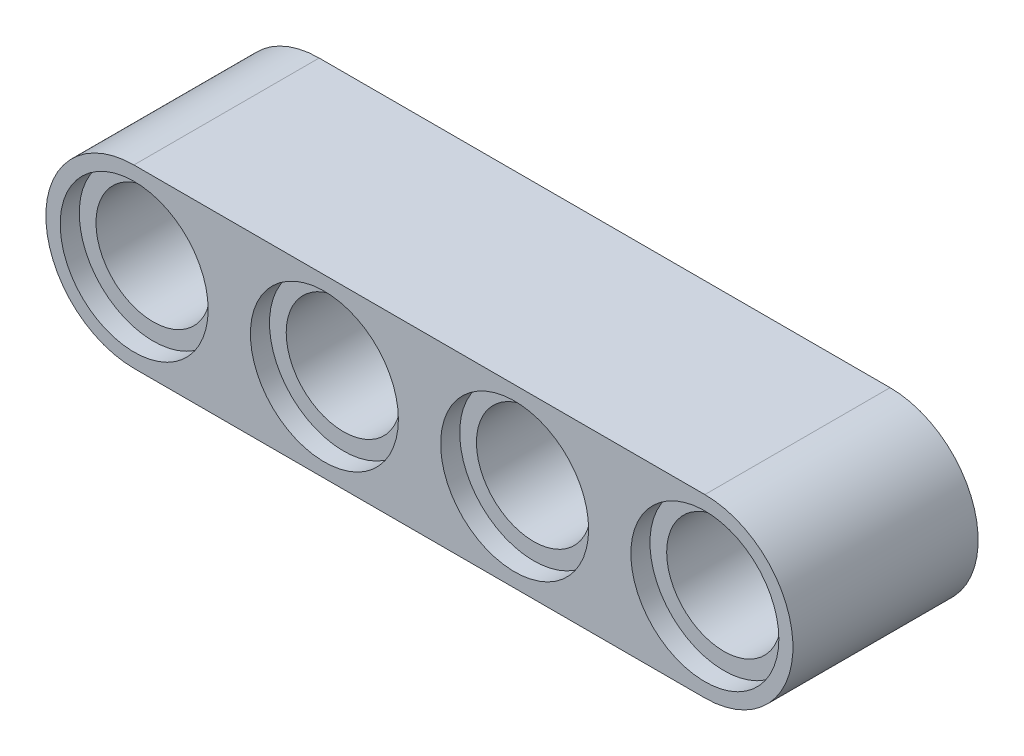
ISO-10303-21;
HEADER;
FILE_DESCRIPTION(('STEP AP214'),'2;1');
FILE_NAME('part.step','',(''),(''),'','','');
FILE_SCHEMA(('AUTOMOTIVE_DESIGN { 1 0 10303 214 1 1 1 1 }'));
ENDSEC;
DATA;
#1=APPLICATION_CONTEXT('core data for automotive mechanical design processes');
#2=APPLICATION_PROTOCOL_DEFINITION('international standard','automotive_design',2000,#1);
#3=PRODUCT_CONTEXT('',#1,'mechanical');
#4=PRODUCT('Part','Part','',(#3));
#5=PRODUCT_RELATED_PRODUCT_CATEGORY('part','',(#4));
#6=PRODUCT_DEFINITION_FORMATION('','',#4);
#7=PRODUCT_DEFINITION_CONTEXT('part definition',#1,'design');
#8=PRODUCT_DEFINITION('design','',#6,#7);
#9=PRODUCT_DEFINITION_SHAPE('','',#8);
#10=(LENGTH_UNIT() NAMED_UNIT(*) SI_UNIT(.MILLI.,.METRE.));
#11=(NAMED_UNIT(*) PLANE_ANGLE_UNIT() SI_UNIT($,.RADIAN.));
#12=(NAMED_UNIT(*) SI_UNIT($,.STERADIAN.) SOLID_ANGLE_UNIT());
#13=UNCERTAINTY_MEASURE_WITH_UNIT(LENGTH_MEASURE(1.E-05),#10,'distance_accuracy_value','');
#14=(GEOMETRIC_REPRESENTATION_CONTEXT(3) GLOBAL_UNCERTAINTY_ASSIGNED_CONTEXT((#13)) GLOBAL_UNIT_ASSIGNED_CONTEXT((#10,
#11,#12)) REPRESENTATION_CONTEXT('',''));
#15=CARTESIAN_POINT('',(0.,0.,0.));
#16=DIRECTION('',(0.,0.,1.));
#17=DIRECTION('',(1.,0.,0.));
#18=AXIS2_PLACEMENT_3D('',#15,#16,#17);
#19=CARTESIAN_POINT('',(-88.6761952861953,0.,7.76));
#20=DIRECTION('',(0.,0.,-1.));
#21=DIRECTION('',(-1.,0.,0.));
#22=AXIS2_PLACEMENT_3D('',#19,#20,#21);
#23=CYLINDRICAL_SURFACE('',#22,2.4);
#24=CARTESIAN_POINT('',(-88.6761952861953,0.,0.8));
#25=DIRECTION('',(0.,0.,-1.));
#26=DIRECTION('',(-1.,0.,0.));
#27=AXIS2_PLACEMENT_3D('',#24,#25,#26);
#28=CIRCLE('',#27,2.4);
#29=CARTESIAN_POINT('',(-91.0761952861953,0.,0.8));
#30=VERTEX_POINT('',#29);
#31=EDGE_CURVE('E120',#30,#30,#28,.T.);
#32=ORIENTED_EDGE('',*,*,#31,.T.);
#33=EDGE_LOOP('',(#32));
#34=FACE_BOUND('',#33,.T.);
#35=CARTESIAN_POINT('',(-88.6761952861953,0.,6.96));
#36=DIRECTION('',(0.,0.,1.));
#37=DIRECTION('',(1.,0.,0.));
#38=AXIS2_PLACEMENT_3D('',#35,#36,#37);
#39=CIRCLE('',#38,2.4);
#40=CARTESIAN_POINT('',(-86.2761952861953,0.,6.96));
#41=VERTEX_POINT('',#40);
#42=EDGE_CURVE('E37',#41,#41,#39,.F.);
#43=ORIENTED_EDGE('',*,*,#42,.F.);
#44=EDGE_LOOP('',(#43));
#45=FACE_BOUND('',#44,.T.);
#46=ADVANCED_FACE('F33',(#34,#45),#23,.F.);
#47=CARTESIAN_POINT('',(-80.7061952861953,0.,7.76));
#48=DIRECTION('',(0.,0.,-1.));
#49=DIRECTION('',(-1.,0.,0.));
#50=AXIS2_PLACEMENT_3D('',#47,#48,#49);
#51=CYLINDRICAL_SURFACE('',#50,2.4);
#52=CARTESIAN_POINT('',(-80.7061952861953,0.,0.8));
#53=DIRECTION('',(0.,0.,-1.));
#54=DIRECTION('',(-1.,0.,0.));
#55=AXIS2_PLACEMENT_3D('',#52,#53,#54);
#56=CIRCLE('',#55,2.4);
#57=CARTESIAN_POINT('',(-83.1061952861953,0.,0.8));
#58=VERTEX_POINT('',#57);
#59=EDGE_CURVE('E124',#58,#58,#56,.T.);
#60=ORIENTED_EDGE('',*,*,#59,.T.);
#61=EDGE_LOOP('',(#60));
#62=FACE_BOUND('',#61,.T.);
#63=CARTESIAN_POINT('',(-80.7061952861953,0.,6.96));
#64=DIRECTION('',(0.,0.,1.));
#65=DIRECTION('',(1.,0.,0.));
#66=AXIS2_PLACEMENT_3D('',#63,#64,#65);
#67=CIRCLE('',#66,2.4);
#68=CARTESIAN_POINT('',(-78.3061952861953,0.,6.96));
#69=VERTEX_POINT('',#68);
#70=EDGE_CURVE('E115',#69,#69,#67,.F.);
#71=ORIENTED_EDGE('',*,*,#70,.F.);
#72=EDGE_LOOP('',(#71));
#73=FACE_BOUND('',#72,.T.);
#74=ADVANCED_FACE('F226',(#62,#73),#51,.F.);
#75=CARTESIAN_POINT('',(-72.7361952861953,0.,7.76));
#76=DIRECTION('',(0.,0.,-1.));
#77=DIRECTION('',(-1.,0.,0.));
#78=AXIS2_PLACEMENT_3D('',#75,#76,#77);
#79=CYLINDRICAL_SURFACE('',#78,2.4);
#80=CARTESIAN_POINT('',(-72.7361952861953,0.,0.8));
#81=DIRECTION('',(0.,0.,-1.));
#82=DIRECTION('',(-1.,0.,0.));
#83=AXIS2_PLACEMENT_3D('',#80,#81,#82);
#84=CIRCLE('',#83,2.4);
#85=CARTESIAN_POINT('',(-75.1361952861953,0.,0.8));
#86=VERTEX_POINT('',#85);
#87=EDGE_CURVE('E129',#86,#86,#84,.T.);
#88=ORIENTED_EDGE('',*,*,#87,.T.);
#89=EDGE_LOOP('',(#88));
#90=FACE_BOUND('',#89,.T.);
#91=CARTESIAN_POINT('',(-72.7361952861953,0.,6.96));
#92=DIRECTION('',(0.,0.,1.));
#93=DIRECTION('',(1.,0.,0.));
#94=AXIS2_PLACEMENT_3D('',#91,#92,#93);
#95=CIRCLE('',#94,2.4);
#96=CARTESIAN_POINT('',(-70.3361952861953,0.,6.96));
#97=VERTEX_POINT('',#96);
#98=EDGE_CURVE('E112',#97,#97,#95,.F.);
#99=ORIENTED_EDGE('',*,*,#98,.F.);
#100=EDGE_LOOP('',(#99));
#101=FACE_BOUND('',#100,.T.);
#102=ADVANCED_FACE('F231',(#90,#101),#79,.F.);
#103=CARTESIAN_POINT('',(-64.7661952861953,0.,7.76));
#104=DIRECTION('',(0.,0.,-1.));
#105=DIRECTION('',(-1.,0.,0.));
#106=AXIS2_PLACEMENT_3D('',#103,#104,#105);
#107=CYLINDRICAL_SURFACE('',#106,2.4);
#108=CARTESIAN_POINT('',(-64.7661952861953,0.,0.8));
#109=DIRECTION('',(0.,0.,-1.));
#110=DIRECTION('',(-1.,0.,0.));
#111=AXIS2_PLACEMENT_3D('',#108,#109,#110);
#112=CIRCLE('',#111,2.4);
#113=CARTESIAN_POINT('',(-67.1661952861953,0.,0.8));
#114=VERTEX_POINT('',#113);
#115=EDGE_CURVE('E155',#114,#114,#112,.T.);
#116=ORIENTED_EDGE('',*,*,#115,.T.);
#117=EDGE_LOOP('',(#116));
#118=FACE_BOUND('',#117,.T.);
#119=CARTESIAN_POINT('',(-64.7661952861953,0.,6.96));
#120=DIRECTION('',(0.,0.,1.));
#121=DIRECTION('',(1.,0.,0.));
#122=AXIS2_PLACEMENT_3D('',#119,#120,#121);
#123=CIRCLE('',#122,2.4);
#124=CARTESIAN_POINT('',(-62.3661952861953,0.,6.96));
#125=VERTEX_POINT('',#124);
#126=EDGE_CURVE('E109',#125,#125,#123,.F.);
#127=ORIENTED_EDGE('',*,*,#126,.F.);
#128=EDGE_LOOP('',(#127));
#129=FACE_BOUND('',#128,.T.);
#130=ADVANCED_FACE('F278',(#118,#129),#107,.F.);
#131=CARTESIAN_POINT('',(-88.6861952861953,0.,7.76));
#132=DIRECTION('',(0.,0.,-1.));
#133=DIRECTION('',(-1.,0.,0.));
#134=AXIS2_PLACEMENT_3D('',#131,#132,#133);
#135=CYLINDRICAL_SURFACE('',#134,3.69);
#136=CARTESIAN_POINT('',(-88.6861952861953,0.,0.));
#137=DIRECTION('',(0.,0.,1.));
#138=DIRECTION('',(1.,0.,0.));
#139=AXIS2_PLACEMENT_3D('',#136,#137,#138);
#140=CIRCLE('',#139,3.69);
#141=CARTESIAN_POINT('',(-88.6861952861953,3.69,0.));
#142=VERTEX_POINT('',#141);
#143=CARTESIAN_POINT('',(-88.6861952861953,-3.69,0.));
#144=VERTEX_POINT('',#143);
#145=EDGE_CURVE('E100',#142,#144,#140,.T.);
#146=ORIENTED_EDGE('',*,*,#145,.T.);
#147=DIRECTION('',(0.,0.,-1.));
#148=VECTOR('',#147,1.);
#149=CARTESIAN_POINT('',(-88.6861952861953,-3.69,7.76));
#150=LINE('',#149,#148);
#151=CARTESIAN_POINT('',(-88.6861952861953,-3.69,7.76));
#152=VERTEX_POINT('',#151);
#153=EDGE_CURVE('E11',#152,#144,#150,.T.);
#154=ORIENTED_EDGE('',*,*,#153,.F.);
#155=CARTESIAN_POINT('',(-88.6861952861953,0.,7.76));
#156=DIRECTION('',(0.,0.,1.));
#157=DIRECTION('',(1.,0.,0.));
#158=AXIS2_PLACEMENT_3D('',#155,#156,#157);
#159=CIRCLE('',#158,3.69);
#160=CARTESIAN_POINT('',(-88.6861952861953,3.69,7.76));
#161=VERTEX_POINT('',#160);
#162=EDGE_CURVE('E87',#161,#152,#159,.T.);
#163=ORIENTED_EDGE('',*,*,#162,.F.);
#164=DIRECTION('',(0.,0.,-1.));
#165=VECTOR('',#164,1.);
#166=CARTESIAN_POINT('',(-88.6861952861953,3.69,7.76));
#167=LINE('',#166,#165);
#168=EDGE_CURVE('E96',#161,#142,#167,.T.);
#169=ORIENTED_EDGE('',*,*,#168,.T.);
#170=EDGE_LOOP('',(#146,#154,#163,#169));
#171=FACE_BOUND('',#170,.T.);
#172=ADVANCED_FACE('F35',(#171),#135,.T.);
#173=CARTESIAN_POINT('',(-88.6861952861953,-3.69,7.76));
#174=DIRECTION('',(0.,1.,0.));
#175=DIRECTION('',(-1.,0.,0.));
#176=AXIS2_PLACEMENT_3D('',#173,#174,#175);
#177=PLANE('',#176);
#178=DIRECTION('',(1.,0.,0.));
#179=VECTOR('',#178,1.);
#180=CARTESIAN_POINT('',(-88.6861952861953,-3.69,0.));
#181=LINE('',#180,#179);
#182=CARTESIAN_POINT('',(-64.7661952861953,-3.69,0.));
#183=VERTEX_POINT('',#182);
#184=EDGE_CURVE('E91',#144,#183,#181,.T.);
#185=ORIENTED_EDGE('',*,*,#184,.T.);
#186=DIRECTION('',(0.,0.,-1.));
#187=VECTOR('',#186,1.);
#188=CARTESIAN_POINT('',(-64.7661952861953,-3.69,7.76));
#189=LINE('',#188,#187);
#190=CARTESIAN_POINT('',(-64.7661952861953,-3.69,7.76));
#191=VERTEX_POINT('',#190);
#192=EDGE_CURVE('E43',#191,#183,#189,.T.);
#193=ORIENTED_EDGE('',*,*,#192,.F.);
#194=DIRECTION('',(1.,0.,0.));
#195=VECTOR('',#194,1.);
#196=CARTESIAN_POINT('',(-88.6861952861953,-3.69,7.76));
#197=LINE('',#196,#195);
#198=EDGE_CURVE('E82',#152,#191,#197,.T.);
#199=ORIENTED_EDGE('',*,*,#198,.F.);
#200=ORIENTED_EDGE('',*,*,#153,.T.);
#201=EDGE_LOOP('',(#185,#193,#199,#200));
#202=FACE_BOUND('',#201,.T.);
#203=ADVANCED_FACE('F90',(#202),#177,.F.);
#204=CARTESIAN_POINT('',(-64.7661952861953,0.,7.76));
#205=DIRECTION('',(0.,0.,-1.));
#206=DIRECTION('',(-1.,0.,0.));
#207=AXIS2_PLACEMENT_3D('',#204,#205,#206);
#208=CYLINDRICAL_SURFACE('',#207,3.69);
#209=CARTESIAN_POINT('',(-64.7661952861953,0.,0.));
#210=DIRECTION('',(0.,0.,1.));
#211=DIRECTION('',(1.,0.,0.));
#212=AXIS2_PLACEMENT_3D('',#209,#210,#211);
#213=CIRCLE('',#212,3.69);
#214=CARTESIAN_POINT('',(-64.7661952861953,3.69,0.));
#215=VERTEX_POINT('',#214);
#216=EDGE_CURVE('E69',#183,#215,#213,.T.);
#217=ORIENTED_EDGE('',*,*,#216,.T.);
#218=DIRECTION('',(0.,0.,-1.));
#219=VECTOR('',#218,1.);
#220=CARTESIAN_POINT('',(-64.7661952861953,3.69,7.76));
#221=LINE('',#220,#219);
#222=CARTESIAN_POINT('',(-64.7661952861953,3.69,7.76));
#223=VERTEX_POINT('',#222);
#224=EDGE_CURVE('E92',#223,#215,#221,.T.);
#225=ORIENTED_EDGE('',*,*,#224,.F.);
#226=CARTESIAN_POINT('',(-64.7661952861953,0.,7.76));
#227=DIRECTION('',(0.,0.,1.));
#228=DIRECTION('',(1.,0.,0.));
#229=AXIS2_PLACEMENT_3D('',#226,#227,#228);
#230=CIRCLE('',#229,3.69);
#231=EDGE_CURVE('E85',#191,#223,#230,.T.);
#232=ORIENTED_EDGE('',*,*,#231,.F.);
#233=ORIENTED_EDGE('',*,*,#192,.T.);
#234=EDGE_LOOP('',(#217,#225,#232,#233));
#235=FACE_BOUND('',#234,.T.);
#236=ADVANCED_FACE('F94',(#235),#208,.T.);
#237=CARTESIAN_POINT('',(-88.6861952861953,3.69,7.76));
#238=DIRECTION('',(0.,-1.,0.));
#239=DIRECTION('',(1.,0.,0.));
#240=AXIS2_PLACEMENT_3D('',#237,#238,#239);
#241=PLANE('',#240);
#242=DIRECTION('',(-1.,0.,0.));
#243=VECTOR('',#242,1.);
#244=CARTESIAN_POINT('',(-88.6861952861953,3.69,0.));
#245=LINE('',#244,#243);
#246=EDGE_CURVE('E75',#215,#142,#245,.T.);
#247=ORIENTED_EDGE('',*,*,#246,.T.);
#248=ORIENTED_EDGE('',*,*,#168,.F.);
#249=DIRECTION('',(-1.,0.,0.));
#250=VECTOR('',#249,1.);
#251=CARTESIAN_POINT('',(-88.6861952861953,3.69,7.76));
#252=LINE('',#251,#250);
#253=EDGE_CURVE('E52',#223,#161,#252,.T.);
#254=ORIENTED_EDGE('',*,*,#253,.F.);
#255=ORIENTED_EDGE('',*,*,#224,.T.);
#256=EDGE_LOOP('',(#247,#248,#254,#255));
#257=FACE_BOUND('',#256,.T.);
#258=ADVANCED_FACE('F199',(#257),#241,.F.);
#259=CARTESIAN_POINT('',(-88.6861952861953,0.,7.76));
#260=DIRECTION('',(0.,0.,1.));
#261=DIRECTION('',(1.,0.,0.));
#262=AXIS2_PLACEMENT_3D('',#259,#260,#261);
#263=PLANE('',#262);
#264=CARTESIAN_POINT('',(-88.6761952861953,0.,7.76));
#265=DIRECTION('',(0.,0.,1.));
#266=DIRECTION('',(1.,0.,0.));
#267=AXIS2_PLACEMENT_3D('',#264,#265,#266);
#268=CIRCLE('',#267,3.1);
#269=CARTESIAN_POINT('',(-85.5761952861953,0.,7.76));
#270=VERTEX_POINT('',#269);
#271=EDGE_CURVE('E182',#270,#270,#268,.T.);
#272=ORIENTED_EDGE('',*,*,#271,.F.);
#273=EDGE_LOOP('',(#272));
#274=FACE_BOUND('',#273,.T.);
#275=CARTESIAN_POINT('',(-80.7061952861953,0.,7.76));
#276=DIRECTION('',(0.,0.,1.));
#277=DIRECTION('',(1.,0.,0.));
#278=AXIS2_PLACEMENT_3D('',#275,#276,#277);
#279=CIRCLE('',#278,3.1);
#280=CARTESIAN_POINT('',(-77.6061952861953,0.,7.76));
#281=VERTEX_POINT('',#280);
#282=EDGE_CURVE('E176',#281,#281,#279,.T.);
#283=ORIENTED_EDGE('',*,*,#282,.F.);
#284=EDGE_LOOP('',(#283));
#285=FACE_BOUND('',#284,.T.);
#286=CARTESIAN_POINT('',(-72.7361952861953,0.,7.76));
#287=DIRECTION('',(0.,0.,1.));
#288=DIRECTION('',(1.,0.,0.));
#289=AXIS2_PLACEMENT_3D('',#286,#287,#288);
#290=CIRCLE('',#289,3.1);
#291=CARTESIAN_POINT('',(-69.6361952861953,0.,7.76));
#292=VERTEX_POINT('',#291);
#293=EDGE_CURVE('E170',#292,#292,#290,.T.);
#294=ORIENTED_EDGE('',*,*,#293,.F.);
#295=EDGE_LOOP('',(#294));
#296=FACE_BOUND('',#295,.T.);
#297=CARTESIAN_POINT('',(-64.7661952861953,0.,7.76));
#298=DIRECTION('',(0.,0.,1.));
#299=DIRECTION('',(1.,0.,0.));
#300=AXIS2_PLACEMENT_3D('',#297,#298,#299);
#301=CIRCLE('',#300,3.1);
#302=CARTESIAN_POINT('',(-61.6661952861953,0.,7.76));
#303=VERTEX_POINT('',#302);
#304=EDGE_CURVE('E164',#303,#303,#301,.T.);
#305=ORIENTED_EDGE('',*,*,#304,.F.);
#306=EDGE_LOOP('',(#305));
#307=FACE_BOUND('',#306,.T.);
#308=ORIENTED_EDGE('',*,*,#162,.T.);
#309=ORIENTED_EDGE('',*,*,#198,.T.);
#310=ORIENTED_EDGE('',*,*,#231,.T.);
#311=ORIENTED_EDGE('',*,*,#253,.T.);
#312=EDGE_LOOP('',(#308,#309,#310,#311));
#313=FACE_BOUND('',#312,.T.);
#314=ADVANCED_FACE('F83',(#274,#285,#296,#307,#313),#263,.T.);
#315=CARTESIAN_POINT('',(-88.6861952861953,0.,0.));
#316=DIRECTION('',(0.,0.,1.));
#317=DIRECTION('',(1.,0.,0.));
#318=AXIS2_PLACEMENT_3D('',#315,#316,#317);
#319=PLANE('',#318);
#320=CARTESIAN_POINT('',(-64.7661952861953,0.,0.));
#321=DIRECTION('',(0.,0.,-1.));
#322=DIRECTION('',(-1.,0.,0.));
#323=AXIS2_PLACEMENT_3D('',#320,#321,#322);
#324=CIRCLE('',#323,3.1);
#325=CARTESIAN_POINT('',(-67.8661952861953,0.,0.));
#326=VERTEX_POINT('',#325);
#327=EDGE_CURVE('E135',#326,#326,#324,.T.);
#328=ORIENTED_EDGE('',*,*,#327,.F.);
#329=EDGE_LOOP('',(#328));
#330=FACE_BOUND('',#329,.T.);
#331=CARTESIAN_POINT('',(-72.7361952861953,0.,0.));
#332=DIRECTION('',(0.,0.,-1.));
#333=DIRECTION('',(-1.,0.,0.));
#334=AXIS2_PLACEMENT_3D('',#331,#332,#333);
#335=CIRCLE('',#334,3.1);
#336=CARTESIAN_POINT('',(-75.8361952861953,0.,0.));
#337=VERTEX_POINT('',#336);
#338=EDGE_CURVE('E141',#337,#337,#335,.T.);
#339=ORIENTED_EDGE('',*,*,#338,.F.);
#340=EDGE_LOOP('',(#339));
#341=FACE_BOUND('',#340,.T.);
#342=CARTESIAN_POINT('',(-80.7061952861953,0.,0.));
#343=DIRECTION('',(0.,0.,-1.));
#344=DIRECTION('',(-1.,0.,0.));
#345=AXIS2_PLACEMENT_3D('',#342,#343,#344);
#346=CIRCLE('',#345,3.1);
#347=CARTESIAN_POINT('',(-83.8061952861953,0.,0.));
#348=VERTEX_POINT('',#347);
#349=EDGE_CURVE('E147',#348,#348,#346,.T.);
#350=ORIENTED_EDGE('',*,*,#349,.F.);
#351=EDGE_LOOP('',(#350));
#352=FACE_BOUND('',#351,.T.);
#353=CARTESIAN_POINT('',(-88.6761952861953,0.,0.));
#354=DIRECTION('',(0.,0.,-1.));
#355=DIRECTION('',(-1.,0.,0.));
#356=AXIS2_PLACEMENT_3D('',#353,#354,#355);
#357=CIRCLE('',#356,3.1);
#358=CARTESIAN_POINT('',(-91.7761952861953,0.,0.));
#359=VERTEX_POINT('',#358);
#360=EDGE_CURVE('E153',#359,#359,#357,.T.);
#361=ORIENTED_EDGE('',*,*,#360,.F.);
#362=EDGE_LOOP('',(#361));
#363=FACE_BOUND('',#362,.T.);
#364=ORIENTED_EDGE('',*,*,#145,.F.);
#365=ORIENTED_EDGE('',*,*,#246,.F.);
#366=ORIENTED_EDGE('',*,*,#216,.F.);
#367=ORIENTED_EDGE('',*,*,#184,.F.);
#368=EDGE_LOOP('',(#364,#365,#366,#367));
#369=FACE_BOUND('',#368,.T.);
#370=ADVANCED_FACE('F198',(#330,#341,#352,#363,#369),#319,.F.);
#371=CARTESIAN_POINT('',(-88.6761952861953,0.,0.8));
#372=DIRECTION('',(0.,0.,-1.));
#373=DIRECTION('',(-1.,0.,0.));
#374=AXIS2_PLACEMENT_3D('',#371,#372,#373);
#375=CYLINDRICAL_SURFACE('',#374,3.1);
#376=CARTESIAN_POINT('',(-88.6761952861953,0.,0.8));
#377=DIRECTION('',(0.,0.,-1.));
#378=DIRECTION('',(-1.,0.,0.));
#379=AXIS2_PLACEMENT_3D('',#376,#377,#378);
#380=CIRCLE('',#379,3.1);
#381=CARTESIAN_POINT('',(-91.7761952861953,0.,0.8));
#382=VERTEX_POINT('',#381);
#383=EDGE_CURVE('E150',#382,#382,#380,.T.);
#384=ORIENTED_EDGE('',*,*,#383,.F.);
#385=EDGE_LOOP('',(#384));
#386=FACE_BOUND('',#385,.T.);
#387=ORIENTED_EDGE('',*,*,#360,.T.);
#388=EDGE_LOOP('',(#387));
#389=FACE_BOUND('',#388,.T.);
#390=ADVANCED_FACE('F263',(#386,#389),#375,.F.);
#391=CARTESIAN_POINT('',(-88.6761952861953,0.,0.8));
#392=DIRECTION('',(0.,0.,-1.));
#393=DIRECTION('',(-1.,0.,0.));
#394=AXIS2_PLACEMENT_3D('',#391,#392,#393);
#395=PLANE('',#394);
#396=ORIENTED_EDGE('',*,*,#31,.F.);
#397=EDGE_LOOP('',(#396));
#398=FACE_BOUND('',#397,.T.);
#399=ORIENTED_EDGE('',*,*,#383,.T.);
#400=EDGE_LOOP('',(#399));
#401=FACE_BOUND('',#400,.T.);
#402=ADVANCED_FACE('F259',(#398,#401),#395,.T.);
#403=CARTESIAN_POINT('',(-80.7061952861953,0.,0.8));
#404=DIRECTION('',(0.,0.,-1.));
#405=DIRECTION('',(-1.,0.,0.));
#406=AXIS2_PLACEMENT_3D('',#403,#404,#405);
#407=CYLINDRICAL_SURFACE('',#406,3.1);
#408=CARTESIAN_POINT('',(-80.7061952861953,0.,0.8));
#409=DIRECTION('',(0.,0.,-1.));
#410=DIRECTION('',(-1.,0.,0.));
#411=AXIS2_PLACEMENT_3D('',#408,#409,#410);
#412=CIRCLE('',#411,3.1);
#413=CARTESIAN_POINT('',(-83.8061952861953,0.,0.8));
#414=VERTEX_POINT('',#413);
#415=EDGE_CURVE('E144',#414,#414,#412,.T.);
#416=ORIENTED_EDGE('',*,*,#415,.F.);
#417=EDGE_LOOP('',(#416));
#418=FACE_BOUND('',#417,.T.);
#419=ORIENTED_EDGE('',*,*,#349,.T.);
#420=EDGE_LOOP('',(#419));
#421=FACE_BOUND('',#420,.T.);
#422=ADVANCED_FACE('F255',(#418,#421),#407,.F.);
#423=CARTESIAN_POINT('',(-80.7061952861953,0.,0.8));
#424=DIRECTION('',(0.,0.,-1.));
#425=DIRECTION('',(-1.,0.,0.));
#426=AXIS2_PLACEMENT_3D('',#423,#424,#425);
#427=PLANE('',#426);
#428=ORIENTED_EDGE('',*,*,#59,.F.);
#429=EDGE_LOOP('',(#428));
#430=FACE_BOUND('',#429,.T.);
#431=ORIENTED_EDGE('',*,*,#415,.T.);
#432=EDGE_LOOP('',(#431));
#433=FACE_BOUND('',#432,.T.);
#434=ADVANCED_FACE('F251',(#430,#433),#427,.T.);
#435=CARTESIAN_POINT('',(-72.7361952861953,0.,0.8));
#436=DIRECTION('',(0.,0.,-1.));
#437=DIRECTION('',(-1.,0.,0.));
#438=AXIS2_PLACEMENT_3D('',#435,#436,#437);
#439=CYLINDRICAL_SURFACE('',#438,3.1);
#440=CARTESIAN_POINT('',(-72.7361952861953,0.,0.8));
#441=DIRECTION('',(0.,0.,-1.));
#442=DIRECTION('',(-1.,0.,0.));
#443=AXIS2_PLACEMENT_3D('',#440,#441,#442);
#444=CIRCLE('',#443,3.1);
#445=CARTESIAN_POINT('',(-75.8361952861953,0.,0.8));
#446=VERTEX_POINT('',#445);
#447=EDGE_CURVE('E138',#446,#446,#444,.T.);
#448=ORIENTED_EDGE('',*,*,#447,.F.);
#449=EDGE_LOOP('',(#448));
#450=FACE_BOUND('',#449,.T.);
#451=ORIENTED_EDGE('',*,*,#338,.T.);
#452=EDGE_LOOP('',(#451));
#453=FACE_BOUND('',#452,.T.);
#454=ADVANCED_FACE('F247',(#450,#453),#439,.F.);
#455=CARTESIAN_POINT('',(-72.7361952861953,0.,0.8));
#456=DIRECTION('',(0.,0.,-1.));
#457=DIRECTION('',(-1.,0.,0.));
#458=AXIS2_PLACEMENT_3D('',#455,#456,#457);
#459=PLANE('',#458);
#460=ORIENTED_EDGE('',*,*,#87,.F.);
#461=EDGE_LOOP('',(#460));
#462=FACE_BOUND('',#461,.T.);
#463=ORIENTED_EDGE('',*,*,#447,.T.);
#464=EDGE_LOOP('',(#463));
#465=FACE_BOUND('',#464,.T.);
#466=ADVANCED_FACE('F243',(#462,#465),#459,.T.);
#467=CARTESIAN_POINT('',(-64.7661952861953,0.,0.8));
#468=DIRECTION('',(0.,0.,-1.));
#469=DIRECTION('',(-1.,0.,0.));
#470=AXIS2_PLACEMENT_3D('',#467,#468,#469);
#471=CYLINDRICAL_SURFACE('',#470,3.1);
#472=CARTESIAN_POINT('',(-64.7661952861953,0.,0.8));
#473=DIRECTION('',(0.,0.,-1.));
#474=DIRECTION('',(-1.,0.,0.));
#475=AXIS2_PLACEMENT_3D('',#472,#473,#474);
#476=CIRCLE('',#475,3.1);
#477=CARTESIAN_POINT('',(-67.8661952861953,0.,0.8));
#478=VERTEX_POINT('',#477);
#479=EDGE_CURVE('E103',#478,#478,#476,.T.);
#480=ORIENTED_EDGE('',*,*,#479,.F.);
#481=EDGE_LOOP('',(#480));
#482=FACE_BOUND('',#481,.T.);
#483=ORIENTED_EDGE('',*,*,#327,.T.);
#484=EDGE_LOOP('',(#483));
#485=FACE_BOUND('',#484,.T.);
#486=ADVANCED_FACE('F239',(#482,#485),#471,.F.);
#487=CARTESIAN_POINT('',(-64.7661952861953,0.,0.8));
#488=DIRECTION('',(0.,0.,-1.));
#489=DIRECTION('',(-1.,0.,0.));
#490=AXIS2_PLACEMENT_3D('',#487,#488,#489);
#491=PLANE('',#490);
#492=ORIENTED_EDGE('',*,*,#115,.F.);
#493=EDGE_LOOP('',(#492));
#494=FACE_BOUND('',#493,.T.);
#495=ORIENTED_EDGE('',*,*,#479,.T.);
#496=EDGE_LOOP('',(#495));
#497=FACE_BOUND('',#496,.T.);
#498=ADVANCED_FACE('F220',(#494,#497),#491,.T.);
#499=CARTESIAN_POINT('',(-64.7661952861953,0.,6.96));
#500=DIRECTION('',(0.,0.,1.));
#501=DIRECTION('',(1.,0.,0.));
#502=AXIS2_PLACEMENT_3D('',#499,#500,#501);
#503=PLANE('',#502);
#504=CARTESIAN_POINT('',(-64.7661952861953,0.,6.96));
#505=DIRECTION('',(0.,0.,1.));
#506=DIRECTION('',(1.,0.,0.));
#507=AXIS2_PLACEMENT_3D('',#504,#505,#506);
#508=CIRCLE('',#507,3.1);
#509=CARTESIAN_POINT('',(-61.6661952861953,0.,6.96));
#510=VERTEX_POINT('',#509);
#511=EDGE_CURVE('E167',#510,#510,#508,.T.);
#512=ORIENTED_EDGE('',*,*,#511,.T.);
#513=EDGE_LOOP('',(#512));
#514=FACE_BOUND('',#513,.T.);
#515=ORIENTED_EDGE('',*,*,#126,.T.);
#516=EDGE_LOOP('',(#515));
#517=FACE_BOUND('',#516,.T.);
#518=ADVANCED_FACE('F210',(#514,#517),#503,.T.);
#519=CARTESIAN_POINT('',(-64.7661952861953,0.,6.96));
#520=DIRECTION('',(0.,0.,1.));
#521=DIRECTION('',(1.,0.,0.));
#522=AXIS2_PLACEMENT_3D('',#519,#520,#521);
#523=CYLINDRICAL_SURFACE('',#522,3.1);
#524=ORIENTED_EDGE('',*,*,#511,.F.);
#525=EDGE_LOOP('',(#524));
#526=FACE_BOUND('',#525,.T.);
#527=ORIENTED_EDGE('',*,*,#304,.T.);
#528=EDGE_LOOP('',(#527));
#529=FACE_BOUND('',#528,.T.);
#530=ADVANCED_FACE('F207',(#526,#529),#523,.F.);
#531=CARTESIAN_POINT('',(-72.7361952861953,0.,6.96));
#532=DIRECTION('',(0.,0.,1.));
#533=DIRECTION('',(1.,0.,0.));
#534=AXIS2_PLACEMENT_3D('',#531,#532,#533);
#535=PLANE('',#534);
#536=CARTESIAN_POINT('',(-72.7361952861953,0.,6.96));
#537=DIRECTION('',(0.,0.,1.));
#538=DIRECTION('',(1.,0.,0.));
#539=AXIS2_PLACEMENT_3D('',#536,#537,#538);
#540=CIRCLE('',#539,3.1);
#541=CARTESIAN_POINT('',(-69.6361952861953,0.,6.96));
#542=VERTEX_POINT('',#541);
#543=EDGE_CURVE('E173',#542,#542,#540,.T.);
#544=ORIENTED_EDGE('',*,*,#543,.T.);
#545=EDGE_LOOP('',(#544));
#546=FACE_BOUND('',#545,.T.);
#547=ORIENTED_EDGE('',*,*,#98,.T.);
#548=EDGE_LOOP('',(#547));
#549=FACE_BOUND('',#548,.T.);
#550=ADVANCED_FACE('F209',(#546,#549),#535,.T.);
#551=CARTESIAN_POINT('',(-72.7361952861953,0.,6.96));
#552=DIRECTION('',(0.,0.,1.));
#553=DIRECTION('',(1.,0.,0.));
#554=AXIS2_PLACEMENT_3D('',#551,#552,#553);
#555=CYLINDRICAL_SURFACE('',#554,3.1);
#556=ORIENTED_EDGE('',*,*,#543,.F.);
#557=EDGE_LOOP('',(#556));
#558=FACE_BOUND('',#557,.T.);
#559=ORIENTED_EDGE('',*,*,#293,.T.);
#560=EDGE_LOOP('',(#559));
#561=FACE_BOUND('',#560,.T.);
#562=ADVANCED_FACE('F217',(#558,#561),#555,.F.);
#563=CARTESIAN_POINT('',(-80.7061952861953,0.,6.96));
#564=DIRECTION('',(0.,0.,1.));
#565=DIRECTION('',(1.,0.,0.));
#566=AXIS2_PLACEMENT_3D('',#563,#564,#565);
#567=PLANE('',#566);
#568=CARTESIAN_POINT('',(-80.7061952861953,0.,6.96));
#569=DIRECTION('',(0.,0.,1.));
#570=DIRECTION('',(1.,0.,0.));
#571=AXIS2_PLACEMENT_3D('',#568,#569,#570);
#572=CIRCLE('',#571,3.1);
#573=CARTESIAN_POINT('',(-77.6061952861953,0.,6.96));
#574=VERTEX_POINT('',#573);
#575=EDGE_CURVE('E179',#574,#574,#572,.T.);
#576=ORIENTED_EDGE('',*,*,#575,.T.);
#577=EDGE_LOOP('',(#576));
#578=FACE_BOUND('',#577,.T.);
#579=ORIENTED_EDGE('',*,*,#70,.T.);
#580=EDGE_LOOP('',(#579));
#581=FACE_BOUND('',#580,.T.);
#582=ADVANCED_FACE('F422',(#578,#581),#567,.T.);
#583=CARTESIAN_POINT('',(-80.7061952861953,0.,6.96));
#584=DIRECTION('',(0.,0.,1.));
#585=DIRECTION('',(1.,0.,0.));
#586=AXIS2_PLACEMENT_3D('',#583,#584,#585);
#587=CYLINDRICAL_SURFACE('',#586,3.1);
#588=ORIENTED_EDGE('',*,*,#575,.F.);
#589=EDGE_LOOP('',(#588));
#590=FACE_BOUND('',#589,.T.);
#591=ORIENTED_EDGE('',*,*,#282,.T.);
#592=EDGE_LOOP('',(#591));
#593=FACE_BOUND('',#592,.T.);
#594=ADVANCED_FACE('F432',(#590,#593),#587,.F.);
#595=CARTESIAN_POINT('',(-88.6761952861953,0.,6.96));
#596=DIRECTION('',(0.,0.,1.));
#597=DIRECTION('',(1.,0.,0.));
#598=AXIS2_PLACEMENT_3D('',#595,#596,#597);
#599=PLANE('',#598);
#600=CARTESIAN_POINT('',(-88.6761952861953,0.,6.96));
#601=DIRECTION('',(0.,0.,1.));
#602=DIRECTION('',(1.,0.,0.));
#603=AXIS2_PLACEMENT_3D('',#600,#601,#602);
#604=CIRCLE('',#603,3.1);
#605=CARTESIAN_POINT('',(-85.5761952861953,0.,6.96));
#606=VERTEX_POINT('',#605);
#607=EDGE_CURVE('E113',#606,#606,#604,.T.);
#608=ORIENTED_EDGE('',*,*,#607,.T.);
#609=EDGE_LOOP('',(#608));
#610=FACE_BOUND('',#609,.T.);
#611=ORIENTED_EDGE('',*,*,#42,.T.);
#612=EDGE_LOOP('',(#611));
#613=FACE_BOUND('',#612,.T.);
#614=ADVANCED_FACE('F188',(#610,#613),#599,.T.);
#615=CARTESIAN_POINT('',(-88.6761952861953,0.,6.96));
#616=DIRECTION('',(0.,0.,1.));
#617=DIRECTION('',(1.,0.,0.));
#618=AXIS2_PLACEMENT_3D('',#615,#616,#617);
#619=CYLINDRICAL_SURFACE('',#618,3.1);
#620=ORIENTED_EDGE('',*,*,#607,.F.);
#621=EDGE_LOOP('',(#620));
#622=FACE_BOUND('',#621,.T.);
#623=ORIENTED_EDGE('',*,*,#271,.T.);
#624=EDGE_LOOP('',(#623));
#625=FACE_BOUND('',#624,.T.);
#626=ADVANCED_FACE('F190',(#622,#625),#619,.F.);
#627=CLOSED_SHELL('',(#46,#74,#102,#130,#172,#203,#236,#258,#314,#370,#390,#402,#422,#434,#454,
#466,#486,#498,#518,#530,#550,#562,#582,#594,#614,#626));
#628=MANIFOLD_SOLID_BREP('B2',#627);
#629=ADVANCED_BREP_SHAPE_REPRESENTATION('',(#18,#628),#14);
#630=SHAPE_DEFINITION_REPRESENTATION(#9,#629);
ENDSEC;
END-ISO-10303-21;
